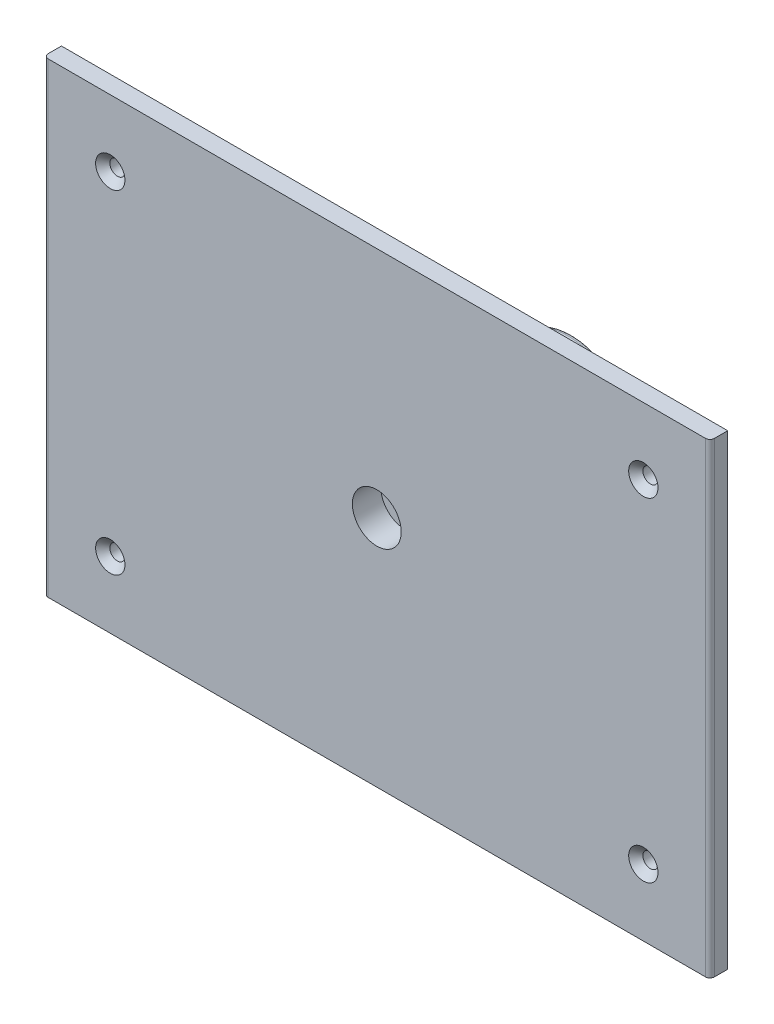
ISO-10303-21;
HEADER;
FILE_DESCRIPTION(('STEP AP214'),'2;1');
FILE_NAME('part.step','',(''),(''),'','','');
FILE_SCHEMA(('AUTOMOTIVE_DESIGN { 1 0 10303 214 1 1 1 1 }'));
ENDSEC;
DATA;
#1=APPLICATION_CONTEXT('core data for automotive mechanical design processes');
#2=APPLICATION_PROTOCOL_DEFINITION('international standard','automotive_design',2000,#1);
#3=PRODUCT_CONTEXT('',#1,'mechanical');
#4=PRODUCT('Part','Part','',(#3));
#5=PRODUCT_RELATED_PRODUCT_CATEGORY('part','',(#4));
#6=PRODUCT_DEFINITION_FORMATION('','',#4);
#7=PRODUCT_DEFINITION_CONTEXT('part definition',#1,'design');
#8=PRODUCT_DEFINITION('design','',#6,#7);
#9=PRODUCT_DEFINITION_SHAPE('','',#8);
#10=(LENGTH_UNIT() NAMED_UNIT(*) SI_UNIT(.MILLI.,.METRE.));
#11=(NAMED_UNIT(*) PLANE_ANGLE_UNIT() SI_UNIT($,.RADIAN.));
#12=(NAMED_UNIT(*) SI_UNIT($,.STERADIAN.) SOLID_ANGLE_UNIT());
#13=UNCERTAINTY_MEASURE_WITH_UNIT(LENGTH_MEASURE(1.E-05),#10,'distance_accuracy_value','');
#14=(GEOMETRIC_REPRESENTATION_CONTEXT(3) GLOBAL_UNCERTAINTY_ASSIGNED_CONTEXT((#13)) GLOBAL_UNIT_ASSIGNED_CONTEXT((#10,
#11,#12)) REPRESENTATION_CONTEXT('',''));
#15=CARTESIAN_POINT('',(0.,0.,0.));
#16=DIRECTION('',(0.,0.,1.));
#17=DIRECTION('',(1.,0.,0.));
#18=AXIS2_PLACEMENT_3D('',#15,#16,#17);
#19=CARTESIAN_POINT('',(-75.,52.5,2.));
#20=DIRECTION('',(1.,0.,0.));
#21=DIRECTION('',(0.,1.,0.));
#22=AXIS2_PLACEMENT_3D('',#19,#20,#21);
#23=PLANE('',#22);
#24=DIRECTION('',(0.,0.,-1.));
#25=VECTOR('',#24,1.);
#26=CARTESIAN_POINT('',(-75.,-52.5,2.));
#27=LINE('',#26,#25);
#28=CARTESIAN_POINT('',(-75.,-52.5,1.));
#29=VERTEX_POINT('',#28);
#30=CARTESIAN_POINT('',(-75.,-52.5,-2.));
#31=VERTEX_POINT('',#30);
#32=EDGE_CURVE('E87',#29,#31,#27,.T.);
#33=ORIENTED_EDGE('',*,*,#32,.F.);
#34=DIRECTION('',(0.,-1.,0.));
#35=VECTOR('',#34,1.);
#36=CARTESIAN_POINT('',(-75.,52.5,1.));
#37=LINE('',#36,#35);
#38=CARTESIAN_POINT('',(-75.,52.5,1.));
#39=VERTEX_POINT('',#38);
#40=EDGE_CURVE('E58',#29,#39,#37,.F.);
#41=ORIENTED_EDGE('',*,*,#40,.T.);
#42=DIRECTION('',(0.,0.,-1.));
#43=VECTOR('',#42,1.);
#44=CARTESIAN_POINT('',(-75.,52.5,2.));
#45=LINE('',#44,#43);
#46=CARTESIAN_POINT('',(-75.,52.5,-2.));
#47=VERTEX_POINT('',#46);
#48=EDGE_CURVE('E107',#39,#47,#45,.T.);
#49=ORIENTED_EDGE('',*,*,#48,.T.);
#50=DIRECTION('',(0.,-1.,0.));
#51=VECTOR('',#50,1.);
#52=CARTESIAN_POINT('',(-75.,52.5,-2.));
#53=LINE('',#52,#51);
#54=EDGE_CURVE('E103',#47,#31,#53,.T.);
#55=ORIENTED_EDGE('',*,*,#54,.T.);
#56=EDGE_LOOP('',(#33,#41,#49,#55));
#57=FACE_BOUND('',#56,.T.);
#58=ADVANCED_FACE('F35',(#57),#23,.F.);
#59=CARTESIAN_POINT('',(75.,-52.5,2.));
#60=DIRECTION('',(0.,1.,0.));
#61=DIRECTION('',(-1.,0.,0.));
#62=AXIS2_PLACEMENT_3D('',#59,#60,#61);
#63=PLANE('',#62);
#64=DIRECTION('',(1.,0.,0.));
#65=VECTOR('',#64,1.);
#66=CARTESIAN_POINT('',(75.,-52.5,2.));
#67=LINE('',#66,#65);
#68=CARTESIAN_POINT('',(-74.,-52.5,2.));
#69=VERTEX_POINT('',#68);
#70=CARTESIAN_POINT('',(74.,-52.5,2.));
#71=VERTEX_POINT('',#70);
#72=EDGE_CURVE('E121',#69,#71,#67,.T.);
#73=ORIENTED_EDGE('',*,*,#72,.F.);
#74=CARTESIAN_POINT('',(-74.,-52.5,1.));
#75=DIRECTION('',(0.,1.,0.));
#76=DIRECTION('',(-1.,0.,0.));
#77=AXIS2_PLACEMENT_3D('',#74,#75,#76);
#78=CIRCLE('',#77,1.);
#79=EDGE_CURVE('E94',#69,#29,#78,.F.);
#80=ORIENTED_EDGE('',*,*,#79,.T.);
#81=ORIENTED_EDGE('',*,*,#32,.T.);
#82=DIRECTION('',(1.,0.,0.));
#83=VECTOR('',#82,1.);
#84=CARTESIAN_POINT('',(75.,-52.5,-2.));
#85=LINE('',#84,#83);
#86=CARTESIAN_POINT('',(75.,-52.5,-2.));
#87=VERTEX_POINT('',#86);
#88=EDGE_CURVE('E92',#31,#87,#85,.T.);
#89=ORIENTED_EDGE('',*,*,#88,.T.);
#90=DIRECTION('',(0.,0.,-1.));
#91=VECTOR('',#90,1.);
#92=CARTESIAN_POINT('',(75.,-52.5,2.));
#93=LINE('',#92,#91);
#94=CARTESIAN_POINT('',(75.,-52.5,1.));
#95=VERTEX_POINT('',#94);
#96=EDGE_CURVE('E97',#95,#87,#93,.T.);
#97=ORIENTED_EDGE('',*,*,#96,.F.);
#98=CARTESIAN_POINT('',(74.,-52.5,1.));
#99=DIRECTION('',(0.,1.,0.));
#100=DIRECTION('',(-1.,0.,0.));
#101=AXIS2_PLACEMENT_3D('',#98,#99,#100);
#102=CIRCLE('',#101,1.);
#103=EDGE_CURVE('E143',#95,#71,#102,.F.);
#104=ORIENTED_EDGE('',*,*,#103,.T.);
#105=EDGE_LOOP('',(#73,#80,#81,#89,#97,#104));
#106=FACE_BOUND('',#105,.T.);
#107=ADVANCED_FACE('F90',(#106),#63,.F.);
#108=CARTESIAN_POINT('',(75.,52.5,2.));
#109=DIRECTION('',(-1.,0.,0.));
#110=DIRECTION('',(0.,-1.,0.));
#111=AXIS2_PLACEMENT_3D('',#108,#109,#110);
#112=PLANE('',#111);
#113=DIRECTION('',(0.,0.,-1.));
#114=VECTOR('',#113,1.);
#115=CARTESIAN_POINT('',(75.,52.5,2.));
#116=LINE('',#115,#114);
#117=CARTESIAN_POINT('',(75.,52.5,1.));
#118=VERTEX_POINT('',#117);
#119=CARTESIAN_POINT('',(75.,52.5,-2.));
#120=VERTEX_POINT('',#119);
#121=EDGE_CURVE('E123',#118,#120,#116,.T.);
#122=ORIENTED_EDGE('',*,*,#121,.F.);
#123=DIRECTION('',(0.,1.,0.));
#124=VECTOR('',#123,1.);
#125=CARTESIAN_POINT('',(75.,52.5,1.));
#126=LINE('',#125,#124);
#127=EDGE_CURVE('E11',#118,#95,#126,.F.);
#128=ORIENTED_EDGE('',*,*,#127,.T.);
#129=ORIENTED_EDGE('',*,*,#96,.T.);
#130=DIRECTION('',(0.,1.,0.));
#131=VECTOR('',#130,1.);
#132=CARTESIAN_POINT('',(75.,52.5,-2.));
#133=LINE('',#132,#131);
#134=EDGE_CURVE('E105',#87,#120,#133,.T.);
#135=ORIENTED_EDGE('',*,*,#134,.T.);
#136=EDGE_LOOP('',(#122,#128,#129,#135));
#137=FACE_BOUND('',#136,.T.);
#138=ADVANCED_FACE('F173',(#137),#112,.F.);
#139=CARTESIAN_POINT('',(75.,52.5,2.));
#140=DIRECTION('',(0.,-1.,0.));
#141=DIRECTION('',(1.,0.,0.));
#142=AXIS2_PLACEMENT_3D('',#139,#140,#141);
#143=PLANE('',#142);
#144=ORIENTED_EDGE('',*,*,#48,.F.);
#145=CARTESIAN_POINT('',(-74.,52.5,1.));
#146=DIRECTION('',(0.,-1.,0.));
#147=DIRECTION('',(1.,0.,0.));
#148=AXIS2_PLACEMENT_3D('',#145,#146,#147);
#149=CIRCLE('',#148,1.);
#150=CARTESIAN_POINT('',(-74.,52.5,2.));
#151=VERTEX_POINT('',#150);
#152=EDGE_CURVE('E43',#39,#151,#149,.F.);
#153=ORIENTED_EDGE('',*,*,#152,.T.);
#154=DIRECTION('',(-1.,0.,0.));
#155=VECTOR('',#154,1.);
#156=CARTESIAN_POINT('',(75.,52.5,2.));
#157=LINE('',#156,#155);
#158=CARTESIAN_POINT('',(74.,52.5,2.));
#159=VERTEX_POINT('',#158);
#160=EDGE_CURVE('E115',#159,#151,#157,.T.);
#161=ORIENTED_EDGE('',*,*,#160,.F.);
#162=CARTESIAN_POINT('',(74.,52.5,1.));
#163=DIRECTION('',(0.,-1.,0.));
#164=DIRECTION('',(1.,0.,0.));
#165=AXIS2_PLACEMENT_3D('',#162,#163,#164);
#166=CIRCLE('',#165,1.);
#167=EDGE_CURVE('E50',#159,#118,#166,.F.);
#168=ORIENTED_EDGE('',*,*,#167,.T.);
#169=ORIENTED_EDGE('',*,*,#121,.T.);
#170=DIRECTION('',(-1.,0.,0.));
#171=VECTOR('',#170,1.);
#172=CARTESIAN_POINT('',(75.,52.5,-2.));
#173=LINE('',#172,#171);
#174=EDGE_CURVE('E119',#120,#47,#173,.T.);
#175=ORIENTED_EDGE('',*,*,#174,.T.);
#176=EDGE_LOOP('',(#144,#153,#161,#168,#169,#175));
#177=FACE_BOUND('',#176,.T.);
#178=ADVANCED_FACE('F149',(#177),#143,.F.);
#179=CARTESIAN_POINT('',(0.,0.,2.));
#180=DIRECTION('',(0.,0.,-1.));
#181=DIRECTION('',(-1.,0.,0.));
#182=AXIS2_PLACEMENT_3D('',#179,#180,#181);
#183=PLANE('',#182);
#184=CARTESIAN_POINT('',(60.,37.5,2.));
#185=DIRECTION('',(0.,0.,-1.));
#186=DIRECTION('',(-1.,0.,0.));
#187=AXIS2_PLACEMENT_3D('',#184,#185,#186);
#188=CIRCLE('',#187,3.3);
#189=CARTESIAN_POINT('',(56.7,37.5,2.));
#190=VERTEX_POINT('',#189);
#191=EDGE_CURVE('E280',#190,#190,#188,.T.);
#192=ORIENTED_EDGE('',*,*,#191,.T.);
#193=EDGE_LOOP('',(#192));
#194=FACE_BOUND('',#193,.T.);
#195=CARTESIAN_POINT('',(-60.,37.5,2.));
#196=DIRECTION('',(0.,0.,-1.));
#197=DIRECTION('',(-1.,0.,0.));
#198=AXIS2_PLACEMENT_3D('',#195,#196,#197);
#199=CIRCLE('',#198,3.3);
#200=CARTESIAN_POINT('',(-63.3,37.5,2.));
#201=VERTEX_POINT('',#200);
#202=EDGE_CURVE('E284',#201,#201,#199,.T.);
#203=ORIENTED_EDGE('',*,*,#202,.T.);
#204=EDGE_LOOP('',(#203));
#205=FACE_BOUND('',#204,.T.);
#206=CARTESIAN_POINT('',(0.,0.,2.));
#207=DIRECTION('',(0.,0.,1.));
#208=DIRECTION('',(1.,0.,0.));
#209=AXIS2_PLACEMENT_3D('',#206,#207,#208);
#210=CIRCLE('',#209,5.5);
#211=CARTESIAN_POINT('',(5.5,0.,2.));
#212=VERTEX_POINT('',#211);
#213=EDGE_CURVE('E299',#212,#212,#210,.T.);
#214=ORIENTED_EDGE('',*,*,#213,.F.);
#215=EDGE_LOOP('',(#214));
#216=FACE_BOUND('',#215,.T.);
#217=CARTESIAN_POINT('',(60.,-37.5,2.));
#218=DIRECTION('',(0.,0.,-1.));
#219=DIRECTION('',(-1.,0.,0.));
#220=AXIS2_PLACEMENT_3D('',#217,#218,#219);
#221=CIRCLE('',#220,3.3);
#222=CARTESIAN_POINT('',(56.7,-37.5,2.));
#223=VERTEX_POINT('',#222);
#224=EDGE_CURVE('E200',#223,#223,#221,.T.);
#225=ORIENTED_EDGE('',*,*,#224,.T.);
#226=EDGE_LOOP('',(#225));
#227=FACE_BOUND('',#226,.T.);
#228=CARTESIAN_POINT('',(-60.,-37.5,2.));
#229=DIRECTION('',(0.,0.,-1.));
#230=DIRECTION('',(-1.,0.,0.));
#231=AXIS2_PLACEMENT_3D('',#228,#229,#230);
#232=CIRCLE('',#231,3.3);
#233=CARTESIAN_POINT('',(-63.3,-37.5,2.));
#234=VERTEX_POINT('',#233);
#235=EDGE_CURVE('E216',#234,#234,#232,.T.);
#236=ORIENTED_EDGE('',*,*,#235,.T.);
#237=EDGE_LOOP('',(#236));
#238=FACE_BOUND('',#237,.T.);
#239=ORIENTED_EDGE('',*,*,#160,.T.);
#240=DIRECTION('',(0.,-1.,0.));
#241=VECTOR('',#240,1.);
#242=CARTESIAN_POINT('',(-74.,0.,2.));
#243=LINE('',#242,#241);
#244=EDGE_CURVE('E140',#151,#69,#243,.T.);
#245=ORIENTED_EDGE('',*,*,#244,.T.);
#246=ORIENTED_EDGE('',*,*,#72,.T.);
#247=DIRECTION('',(0.,1.,0.));
#248=VECTOR('',#247,1.);
#249=CARTESIAN_POINT('',(74.,0.,2.));
#250=LINE('',#249,#248);
#251=EDGE_CURVE('E137',#71,#159,#250,.T.);
#252=ORIENTED_EDGE('',*,*,#251,.T.);
#253=EDGE_LOOP('',(#239,#245,#246,#252));
#254=FACE_BOUND('',#253,.T.);
#255=ADVANCED_FACE('F153',(#194,#205,#216,#227,#238,#254),#183,.F.);
#256=CARTESIAN_POINT('',(0.,0.,-2.));
#257=DIRECTION('',(0.,0.,-1.));
#258=DIRECTION('',(-1.,0.,0.));
#259=AXIS2_PLACEMENT_3D('',#256,#257,#258);
#260=PLANE('',#259);
#261=CARTESIAN_POINT('',(0.,0.,-2.));
#262=DIRECTION('',(0.,0.,-1.));
#263=DIRECTION('',(-1.,0.,0.));
#264=AXIS2_PLACEMENT_3D('',#261,#262,#263);
#265=CIRCLE('',#264,15.);
#266=CARTESIAN_POINT('',(-15.,0.,-2.));
#267=VERTEX_POINT('',#266);
#268=EDGE_CURVE('E134',#267,#267,#265,.F.);
#269=ORIENTED_EDGE('',*,*,#268,.T.);
#270=EDGE_LOOP('',(#269));
#271=FACE_BOUND('',#270,.T.);
#272=CARTESIAN_POINT('',(60.,37.5,-2.));
#273=DIRECTION('',(0.,0.,-1.));
#274=DIRECTION('',(-1.,0.,0.));
#275=AXIS2_PLACEMENT_3D('',#272,#273,#274);
#276=CIRCLE('',#275,1.69999999999999);
#277=CARTESIAN_POINT('',(58.3,37.5,-2.));
#278=VERTEX_POINT('',#277);
#279=EDGE_CURVE('E285',#278,#278,#276,.T.);
#280=ORIENTED_EDGE('',*,*,#279,.F.);
#281=EDGE_LOOP('',(#280));
#282=FACE_BOUND('',#281,.T.);
#283=CARTESIAN_POINT('',(-60.,37.5,-2.));
#284=DIRECTION('',(0.,0.,-1.));
#285=DIRECTION('',(-1.,0.,0.));
#286=AXIS2_PLACEMENT_3D('',#283,#284,#285);
#287=CIRCLE('',#286,1.69999999999999);
#288=CARTESIAN_POINT('',(-61.7,37.5,-2.));
#289=VERTEX_POINT('',#288);
#290=EDGE_CURVE('E288',#289,#289,#287,.T.);
#291=ORIENTED_EDGE('',*,*,#290,.F.);
#292=EDGE_LOOP('',(#291));
#293=FACE_BOUND('',#292,.T.);
#294=CARTESIAN_POINT('',(60.,-37.5,-2.));
#295=DIRECTION('',(0.,0.,-1.));
#296=DIRECTION('',(-1.,0.,0.));
#297=AXIS2_PLACEMENT_3D('',#294,#295,#296);
#298=CIRCLE('',#297,1.69999999999999);
#299=CARTESIAN_POINT('',(58.3,-37.5,-2.));
#300=VERTEX_POINT('',#299);
#301=EDGE_CURVE('E204',#300,#300,#298,.T.);
#302=ORIENTED_EDGE('',*,*,#301,.F.);
#303=EDGE_LOOP('',(#302));
#304=FACE_BOUND('',#303,.T.);
#305=CARTESIAN_POINT('',(-60.,-37.5,-2.));
#306=DIRECTION('',(0.,0.,-1.));
#307=DIRECTION('',(-1.,0.,0.));
#308=AXIS2_PLACEMENT_3D('',#305,#306,#307);
#309=CIRCLE('',#308,1.69999999999999);
#310=CARTESIAN_POINT('',(-61.7,-37.5,-2.));
#311=VERTEX_POINT('',#310);
#312=EDGE_CURVE('E112',#311,#311,#309,.T.);
#313=ORIENTED_EDGE('',*,*,#312,.F.);
#314=EDGE_LOOP('',(#313));
#315=FACE_BOUND('',#314,.T.);
#316=ORIENTED_EDGE('',*,*,#54,.F.);
#317=ORIENTED_EDGE('',*,*,#174,.F.);
#318=ORIENTED_EDGE('',*,*,#134,.F.);
#319=ORIENTED_EDGE('',*,*,#88,.F.);
#320=EDGE_LOOP('',(#316,#317,#318,#319));
#321=FACE_BOUND('',#320,.T.);
#322=ADVANCED_FACE('F101',(#271,#282,#293,#304,#315,#321),#260,.T.);
#323=CARTESIAN_POINT('',(-60.,-37.5,0.399999999999999));
#324=DIRECTION('',(0.,0.,1.));
#325=DIRECTION('',(1.,0.,0.));
#326=AXIS2_PLACEMENT_3D('',#323,#324,#325);
#327=CONICAL_SURFACE('',#326,1.7,0.785398163397447);
#328=ORIENTED_EDGE('',*,*,#235,.F.);
#329=EDGE_LOOP('',(#328));
#330=FACE_BOUND('',#329,.T.);
#331=CARTESIAN_POINT('',(-60.,-37.5,0.399999999999999));
#332=DIRECTION('',(0.,0.,-1.));
#333=DIRECTION('',(-1.,0.,0.));
#334=AXIS2_PLACEMENT_3D('',#331,#332,#333);
#335=CIRCLE('',#334,1.7);
#336=CARTESIAN_POINT('',(-61.7,-37.5,0.399999999999999));
#337=VERTEX_POINT('',#336);
#338=EDGE_CURVE('E109',#337,#337,#335,.T.);
#339=ORIENTED_EDGE('',*,*,#338,.T.);
#340=EDGE_LOOP('',(#339));
#341=FACE_BOUND('',#340,.T.);
#342=ADVANCED_FACE('F231',(#330,#341),#327,.F.);
#343=CARTESIAN_POINT('',(-60.,-37.5,-2.));
#344=DIRECTION('',(0.,0.,-1.));
#345=DIRECTION('',(-1.,0.,0.));
#346=AXIS2_PLACEMENT_3D('',#343,#344,#345);
#347=CYLINDRICAL_SURFACE('',#346,1.69999999999999);
#348=ORIENTED_EDGE('',*,*,#338,.F.);
#349=EDGE_LOOP('',(#348));
#350=FACE_BOUND('',#349,.T.);
#351=ORIENTED_EDGE('',*,*,#312,.T.);
#352=EDGE_LOOP('',(#351));
#353=FACE_BOUND('',#352,.T.);
#354=ADVANCED_FACE('F238',(#350,#353),#347,.F.);
#355=CARTESIAN_POINT('',(60.,-37.5,0.399999999999999));
#356=DIRECTION('',(0.,0.,1.));
#357=DIRECTION('',(1.,0.,0.));
#358=AXIS2_PLACEMENT_3D('',#355,#356,#357);
#359=CONICAL_SURFACE('',#358,1.7,0.785398163397447);
#360=ORIENTED_EDGE('',*,*,#224,.F.);
#361=EDGE_LOOP('',(#360));
#362=FACE_BOUND('',#361,.T.);
#363=CARTESIAN_POINT('',(60.,-37.5,0.399999999999999));
#364=DIRECTION('',(0.,0.,-1.));
#365=DIRECTION('',(-1.,0.,0.));
#366=AXIS2_PLACEMENT_3D('',#363,#364,#365);
#367=CIRCLE('',#366,1.7);
#368=CARTESIAN_POINT('',(58.3,-37.5,0.399999999999999));
#369=VERTEX_POINT('',#368);
#370=EDGE_CURVE('E213',#369,#369,#367,.T.);
#371=ORIENTED_EDGE('',*,*,#370,.T.);
#372=EDGE_LOOP('',(#371));
#373=FACE_BOUND('',#372,.T.);
#374=ADVANCED_FACE('F242',(#362,#373),#359,.F.);
#375=CARTESIAN_POINT('',(60.,-37.5,-2.));
#376=DIRECTION('',(0.,0.,-1.));
#377=DIRECTION('',(-1.,0.,0.));
#378=AXIS2_PLACEMENT_3D('',#375,#376,#377);
#379=CYLINDRICAL_SURFACE('',#378,1.69999999999999);
#380=ORIENTED_EDGE('',*,*,#370,.F.);
#381=EDGE_LOOP('',(#380));
#382=FACE_BOUND('',#381,.T.);
#383=ORIENTED_EDGE('',*,*,#301,.T.);
#384=EDGE_LOOP('',(#383));
#385=FACE_BOUND('',#384,.T.);
#386=ADVANCED_FACE('F246',(#382,#385),#379,.F.);
#387=CARTESIAN_POINT('',(0.,0.,-42.));
#388=DIRECTION('',(0.,0.,1.));
#389=DIRECTION('',(1.,0.,0.));
#390=AXIS2_PLACEMENT_3D('',#387,#388,#389);
#391=CYLINDRICAL_SURFACE('',#390,14.);
#392=CARTESIAN_POINT('',(0.,0.,-3.));
#393=DIRECTION('',(0.,0.,-1.));
#394=DIRECTION('',(-1.,0.,0.));
#395=AXIS2_PLACEMENT_3D('',#392,#393,#394);
#396=CIRCLE('',#395,14.);
#397=CARTESIAN_POINT('',(-14.,0.,-3.));
#398=VERTEX_POINT('',#397);
#399=EDGE_CURVE('E131',#398,#398,#396,.T.);
#400=ORIENTED_EDGE('',*,*,#399,.T.);
#401=EDGE_LOOP('',(#400));
#402=FACE_BOUND('',#401,.T.);
#403=CARTESIAN_POINT('',(0.,0.,-41.));
#404=DIRECTION('',(0.,0.,-1.));
#405=DIRECTION('',(-1.,0.,0.));
#406=AXIS2_PLACEMENT_3D('',#403,#404,#405);
#407=CIRCLE('',#406,14.);
#408=CARTESIAN_POINT('',(-14.,0.,-41.));
#409=VERTEX_POINT('',#408);
#410=EDGE_CURVE('E128',#409,#409,#407,.F.);
#411=ORIENTED_EDGE('',*,*,#410,.T.);
#412=EDGE_LOOP('',(#411));
#413=FACE_BOUND('',#412,.T.);
#414=ADVANCED_FACE('F194',(#402,#413),#391,.T.);
#415=CARTESIAN_POINT('',(0.,0.,-42.));
#416=DIRECTION('',(0.,0.,-1.));
#417=DIRECTION('',(-1.,0.,0.));
#418=AXIS2_PLACEMENT_3D('',#415,#416,#417);
#419=PLANE('',#418);
#420=CARTESIAN_POINT('',(0.,0.,-42.));
#421=DIRECTION('',(0.,0.,-1.));
#422=DIRECTION('',(-1.,0.,0.));
#423=AXIS2_PLACEMENT_3D('',#420,#421,#422);
#424=CIRCLE('',#423,13.);
#425=CARTESIAN_POINT('',(-13.,0.,-42.));
#426=VERTEX_POINT('',#425);
#427=EDGE_CURVE('E96',#426,#426,#424,.T.);
#428=ORIENTED_EDGE('',*,*,#427,.T.);
#429=EDGE_LOOP('',(#428));
#430=FACE_BOUND('',#429,.T.);
#431=CARTESIAN_POINT('',(0.,0.,-42.));
#432=DIRECTION('',(0.,0.,-1.));
#433=DIRECTION('',(-1.,0.,0.));
#434=AXIS2_PLACEMENT_3D('',#431,#432,#433);
#435=CIRCLE('',#434,3.3);
#436=CARTESIAN_POINT('',(-3.3,0.,-42.));
#437=VERTEX_POINT('',#436);
#438=EDGE_CURVE('E198',#437,#437,#435,.T.);
#439=ORIENTED_EDGE('',*,*,#438,.F.);
#440=EDGE_LOOP('',(#439));
#441=FACE_BOUND('',#440,.T.);
#442=ADVANCED_FACE('F190',(#430,#441),#419,.T.);
#443=CARTESIAN_POINT('',(0.,0.,2.));
#444=DIRECTION('',(0.,0.,1.));
#445=DIRECTION('',(1.,0.,0.));
#446=AXIS2_PLACEMENT_3D('',#443,#444,#445);
#447=CYLINDRICAL_SURFACE('',#446,3.3);
#448=CARTESIAN_POINT('',(0.,0.,-4.4));
#449=DIRECTION('',(0.,0.,1.));
#450=DIRECTION('',(1.,0.,0.));
#451=AXIS2_PLACEMENT_3D('',#448,#449,#450);
#452=CIRCLE('',#451,3.3);
#453=CARTESIAN_POINT('',(3.3,0.,-4.4));
#454=VERTEX_POINT('',#453);
#455=EDGE_CURVE('E201',#454,#454,#452,.T.);
#456=ORIENTED_EDGE('',*,*,#455,.T.);
#457=EDGE_LOOP('',(#456));
#458=FACE_BOUND('',#457,.T.);
#459=ORIENTED_EDGE('',*,*,#438,.T.);
#460=EDGE_LOOP('',(#459));
#461=FACE_BOUND('',#460,.T.);
#462=ADVANCED_FACE('F193',(#458,#461),#447,.F.);
#463=CARTESIAN_POINT('',(3.3,0.,-4.4));
#464=DIRECTION('',(0.,0.,-1.));
#465=DIRECTION('',(-1.,0.,0.));
#466=AXIS2_PLACEMENT_3D('',#463,#464,#465);
#467=PLANE('',#466);
#468=ORIENTED_EDGE('',*,*,#455,.F.);
#469=EDGE_LOOP('',(#468));
#470=FACE_BOUND('',#469,.T.);
#471=CARTESIAN_POINT('',(0.,0.,-4.4));
#472=DIRECTION('',(0.,0.,1.));
#473=DIRECTION('',(1.,0.,0.));
#474=AXIS2_PLACEMENT_3D('',#471,#472,#473);
#475=CIRCLE('',#474,5.5);
#476=CARTESIAN_POINT('',(5.5,0.,-4.4));
#477=VERTEX_POINT('',#476);
#478=EDGE_CURVE('E207',#477,#477,#475,.T.);
#479=ORIENTED_EDGE('',*,*,#478,.T.);
#480=EDGE_LOOP('',(#479));
#481=FACE_BOUND('',#480,.T.);
#482=ADVANCED_FACE('F256',(#470,#481),#467,.F.);
#483=CARTESIAN_POINT('',(0.,0.,2.));
#484=DIRECTION('',(0.,0.,1.));
#485=DIRECTION('',(1.,0.,0.));
#486=AXIS2_PLACEMENT_3D('',#483,#484,#485);
#487=CYLINDRICAL_SURFACE('',#486,5.5);
#488=ORIENTED_EDGE('',*,*,#478,.F.);
#489=EDGE_LOOP('',(#488));
#490=FACE_BOUND('',#489,.T.);
#491=ORIENTED_EDGE('',*,*,#213,.T.);
#492=EDGE_LOOP('',(#491));
#493=FACE_BOUND('',#492,.T.);
#494=ADVANCED_FACE('F260',(#490,#493),#487,.F.);
#495=CARTESIAN_POINT('',(-60.,37.5,0.399999999999999));
#496=DIRECTION('',(0.,0.,1.));
#497=DIRECTION('',(1.,0.,0.));
#498=AXIS2_PLACEMENT_3D('',#495,#496,#497);
#499=CONICAL_SURFACE('',#498,1.7,0.785398163397447);
#500=ORIENTED_EDGE('',*,*,#202,.F.);
#501=EDGE_LOOP('',(#500));
#502=FACE_BOUND('',#501,.T.);
#503=CARTESIAN_POINT('',(-60.,37.5,0.399999999999999));
#504=DIRECTION('',(0.,0.,-1.));
#505=DIRECTION('',(-1.,0.,0.));
#506=AXIS2_PLACEMENT_3D('',#503,#504,#505);
#507=CIRCLE('',#506,1.7);
#508=CARTESIAN_POINT('',(-61.7,37.5,0.399999999999999));
#509=VERTEX_POINT('',#508);
#510=EDGE_CURVE('E296',#509,#509,#507,.T.);
#511=ORIENTED_EDGE('',*,*,#510,.T.);
#512=EDGE_LOOP('',(#511));
#513=FACE_BOUND('',#512,.T.);
#514=ADVANCED_FACE('F264',(#502,#513),#499,.F.);
#515=CARTESIAN_POINT('',(-60.,37.5,-2.));
#516=DIRECTION('',(0.,0.,-1.));
#517=DIRECTION('',(-1.,0.,0.));
#518=AXIS2_PLACEMENT_3D('',#515,#516,#517);
#519=CYLINDRICAL_SURFACE('',#518,1.69999999999999);
#520=ORIENTED_EDGE('',*,*,#510,.F.);
#521=EDGE_LOOP('',(#520));
#522=FACE_BOUND('',#521,.T.);
#523=ORIENTED_EDGE('',*,*,#290,.T.);
#524=EDGE_LOOP('',(#523));
#525=FACE_BOUND('',#524,.T.);
#526=ADVANCED_FACE('F268',(#522,#525),#519,.F.);
#527=CARTESIAN_POINT('',(60.,37.5,0.399999999999999));
#528=DIRECTION('',(0.,0.,1.));
#529=DIRECTION('',(1.,0.,0.));
#530=AXIS2_PLACEMENT_3D('',#527,#528,#529);
#531=CONICAL_SURFACE('',#530,1.7,0.785398163397447);
#532=ORIENTED_EDGE('',*,*,#191,.F.);
#533=EDGE_LOOP('',(#532));
#534=FACE_BOUND('',#533,.T.);
#535=CARTESIAN_POINT('',(60.,37.5,0.399999999999999));
#536=DIRECTION('',(0.,0.,-1.));
#537=DIRECTION('',(-1.,0.,0.));
#538=AXIS2_PLACEMENT_3D('',#535,#536,#537);
#539=CIRCLE('',#538,1.7);
#540=CARTESIAN_POINT('',(58.3,37.5,0.399999999999999));
#541=VERTEX_POINT('',#540);
#542=EDGE_CURVE('E283',#541,#541,#539,.T.);
#543=ORIENTED_EDGE('',*,*,#542,.T.);
#544=EDGE_LOOP('',(#543));
#545=FACE_BOUND('',#544,.T.);
#546=ADVANCED_FACE('F183',(#534,#545),#531,.F.);
#547=CARTESIAN_POINT('',(60.,37.5,-2.));
#548=DIRECTION('',(0.,0.,-1.));
#549=DIRECTION('',(-1.,0.,0.));
#550=AXIS2_PLACEMENT_3D('',#547,#548,#549);
#551=CYLINDRICAL_SURFACE('',#550,1.69999999999999);
#552=ORIENTED_EDGE('',*,*,#542,.F.);
#553=EDGE_LOOP('',(#552));
#554=FACE_BOUND('',#553,.T.);
#555=ORIENTED_EDGE('',*,*,#279,.T.);
#556=EDGE_LOOP('',(#555));
#557=FACE_BOUND('',#556,.T.);
#558=ADVANCED_FACE('F178',(#554,#557),#551,.F.);
#559=CARTESIAN_POINT('',(0.,0.,-41.));
#560=DIRECTION('',(0.,0.,-1.));
#561=DIRECTION('',(-1.,0.,0.));
#562=AXIS2_PLACEMENT_3D('',#559,#560,#561);
#563=TOROIDAL_SURFACE('',#562,13.,1.);
#564=ORIENTED_EDGE('',*,*,#410,.F.);
#565=EDGE_LOOP('',(#564));
#566=FACE_BOUND('',#565,.T.);
#567=ORIENTED_EDGE('',*,*,#427,.F.);
#568=EDGE_LOOP('',(#567));
#569=FACE_BOUND('',#568,.T.);
#570=ADVANCED_FACE('F164',(#566,#569),#563,.T.);
#571=CARTESIAN_POINT('',(0.,0.,-3.));
#572=DIRECTION('',(0.,0.,-1.));
#573=DIRECTION('',(-1.,0.,0.));
#574=AXIS2_PLACEMENT_3D('',#571,#572,#573);
#575=TOROIDAL_SURFACE('',#574,15.,1.);
#576=ORIENTED_EDGE('',*,*,#268,.F.);
#577=EDGE_LOOP('',(#576));
#578=FACE_BOUND('',#577,.T.);
#579=ORIENTED_EDGE('',*,*,#399,.F.);
#580=EDGE_LOOP('',(#579));
#581=FACE_BOUND('',#580,.T.);
#582=ADVANCED_FACE('F158',(#578,#581),#575,.F.);
#583=CARTESIAN_POINT('',(-74.,0.,1.));
#584=DIRECTION('',(0.,-1.,0.));
#585=DIRECTION('',(1.,0.,0.));
#586=AXIS2_PLACEMENT_3D('',#583,#584,#585);
#587=CYLINDRICAL_SURFACE('',#586,1.);
#588=ORIENTED_EDGE('',*,*,#152,.F.);
#589=ORIENTED_EDGE('',*,*,#40,.F.);
#590=ORIENTED_EDGE('',*,*,#79,.F.);
#591=ORIENTED_EDGE('',*,*,#244,.F.);
#592=EDGE_LOOP('',(#588,#589,#590,#591));
#593=FACE_BOUND('',#592,.T.);
#594=ADVANCED_FACE('F156',(#593),#587,.T.);
#595=CARTESIAN_POINT('',(74.,0.,1.));
#596=DIRECTION('',(0.,1.,0.));
#597=DIRECTION('',(-1.,0.,0.));
#598=AXIS2_PLACEMENT_3D('',#595,#596,#597);
#599=CYLINDRICAL_SURFACE('',#598,1.);
#600=ORIENTED_EDGE('',*,*,#103,.F.);
#601=ORIENTED_EDGE('',*,*,#127,.F.);
#602=ORIENTED_EDGE('',*,*,#167,.F.);
#603=ORIENTED_EDGE('',*,*,#251,.F.);
#604=EDGE_LOOP('',(#600,#601,#602,#603));
#605=FACE_BOUND('',#604,.T.);
#606=ADVANCED_FACE('F37',(#605),#599,.T.);
#607=CLOSED_SHELL('',(#58,#107,#138,#178,#255,#322,#342,#354,#374,#386,#414,#442,#462,#482,#494,
#514,#526,#546,#558,#570,#582,#594,#606));
#608=MANIFOLD_SOLID_BREP('B2',#607);
#609=ADVANCED_BREP_SHAPE_REPRESENTATION('',(#18,#608),#14);
#610=SHAPE_DEFINITION_REPRESENTATION(#9,#609);
ENDSEC;
END-ISO-10303-21;
